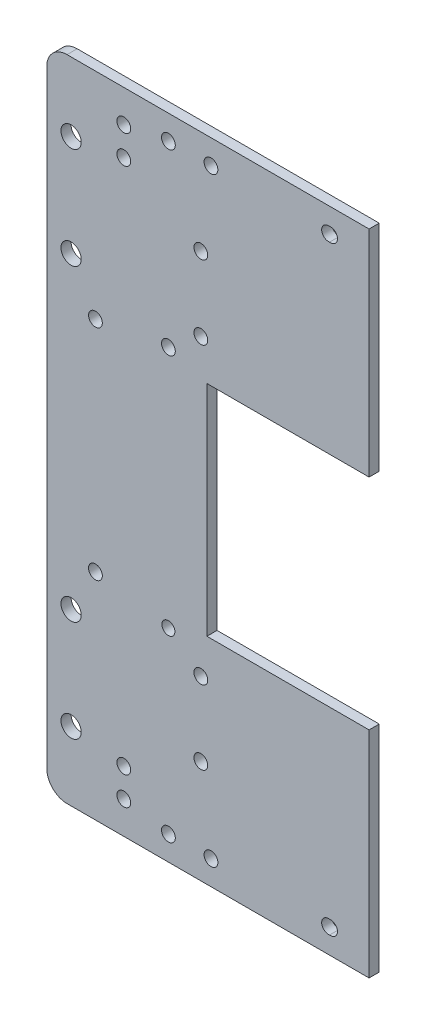
ISO-10303-21;
HEADER;
FILE_DESCRIPTION(('STEP AP214'),'2;1');
FILE_NAME('part.step','',(''),(''),'','','');
FILE_SCHEMA(('AUTOMOTIVE_DESIGN { 1 0 10303 214 1 1 1 1 }'));
ENDSEC;
DATA;
#1=APPLICATION_CONTEXT('core data for automotive mechanical design processes');
#2=APPLICATION_PROTOCOL_DEFINITION('international standard','automotive_design',2000,#1);
#3=PRODUCT_CONTEXT('',#1,'mechanical');
#4=PRODUCT('Part','Part','',(#3));
#5=PRODUCT_RELATED_PRODUCT_CATEGORY('part','',(#4));
#6=PRODUCT_DEFINITION_FORMATION('','',#4);
#7=PRODUCT_DEFINITION_CONTEXT('part definition',#1,'design');
#8=PRODUCT_DEFINITION('design','',#6,#7);
#9=PRODUCT_DEFINITION_SHAPE('','',#8);
#10=(LENGTH_UNIT() NAMED_UNIT(*) SI_UNIT(.MILLI.,.METRE.));
#11=(NAMED_UNIT(*) PLANE_ANGLE_UNIT() SI_UNIT($,.RADIAN.));
#12=(NAMED_UNIT(*) SI_UNIT($,.STERADIAN.) SOLID_ANGLE_UNIT());
#13=UNCERTAINTY_MEASURE_WITH_UNIT(LENGTH_MEASURE(1.E-05),#10,'distance_accuracy_value','');
#14=(GEOMETRIC_REPRESENTATION_CONTEXT(3) GLOBAL_UNCERTAINTY_ASSIGNED_CONTEXT((#13)) GLOBAL_UNIT_ASSIGNED_CONTEXT((#10,
#11,#12)) REPRESENTATION_CONTEXT('',''));
#15=CARTESIAN_POINT('',(0.,0.,0.));
#16=DIRECTION('',(0.,0.,1.));
#17=DIRECTION('',(1.,0.,0.));
#18=AXIS2_PLACEMENT_3D('',#15,#16,#17);
#19=CARTESIAN_POINT('',(0.,0.,0.));
#20=DIRECTION('',(0.,0.,-1.));
#21=DIRECTION('',(-1.,0.,0.));
#22=AXIS2_PLACEMENT_3D('',#19,#20,#21);
#23=PLANE('',#22);
#24=CARTESIAN_POINT('',(6.,42.,0.));
#25=DIRECTION('',(0.,0.,1.));
#26=DIRECTION('',(1.,0.,0.));
#27=AXIS2_PLACEMENT_3D('',#24,#25,#26);
#28=CIRCLE('',#27,2.49999999999999);
#29=CARTESIAN_POINT('',(8.49999999999999,42.,0.));
#30=VERTEX_POINT('',#29);
#31=EDGE_CURVE('E189',#30,#30,#28,.T.);
#32=ORIENTED_EDGE('',*,*,#31,.F.);
#33=EDGE_LOOP('',(#32));
#34=FACE_BOUND('',#33,.T.);
#35=CARTESIAN_POINT('',(30.,6.,0.));
#36=DIRECTION('',(0.,0.,1.));
#37=DIRECTION('',(1.,0.,0.));
#38=AXIS2_PLACEMENT_3D('',#35,#36,#37);
#39=CIRCLE('',#38,1.69999999999999);
#40=CARTESIAN_POINT('',(31.7,6.,0.));
#41=VERTEX_POINT('',#40);
#42=EDGE_CURVE('E321',#41,#41,#39,.T.);
#43=ORIENTED_EDGE('',*,*,#42,.F.);
#44=EDGE_LOOP('',(#43));
#45=FACE_BOUND('',#44,.T.);
#46=CARTESIAN_POINT('',(30.,50.,0.));
#47=DIRECTION('',(0.,0.,1.));
#48=DIRECTION('',(1.,0.,0.));
#49=AXIS2_PLACEMENT_3D('',#46,#47,#48);
#50=CIRCLE('',#49,1.59999999999998);
#51=CARTESIAN_POINT('',(31.6,50.,0.));
#52=VERTEX_POINT('',#51);
#53=EDGE_CURVE('E291',#52,#52,#50,.T.);
#54=ORIENTED_EDGE('',*,*,#53,.F.);
#55=EDGE_LOOP('',(#54));
#56=FACE_BOUND('',#55,.T.);
#57=CARTESIAN_POINT('',(19.,152.,0.));
#58=DIRECTION('',(0.,0.,1.));
#59=DIRECTION('',(1.,0.,0.));
#60=AXIS2_PLACEMENT_3D('',#57,#58,#59);
#61=CIRCLE('',#60,1.69999999999999);
#62=CARTESIAN_POINT('',(20.7,152.,0.));
#63=VERTEX_POINT('',#62);
#64=EDGE_CURVE('E294',#63,#63,#61,.T.);
#65=ORIENTED_EDGE('',*,*,#64,.F.);
#66=EDGE_LOOP('',(#65));
#67=FACE_BOUND('',#66,.T.);
#68=CARTESIAN_POINT('',(12.,107.,0.));
#69=DIRECTION('',(0.,0.,1.));
#70=DIRECTION('',(1.,0.,0.));
#71=AXIS2_PLACEMENT_3D('',#68,#69,#70);
#72=CIRCLE('',#71,1.69999999999999);
#73=CARTESIAN_POINT('',(13.7,107.,0.));
#74=VERTEX_POINT('',#73);
#75=EDGE_CURVE('E297',#74,#74,#72,.T.);
#76=ORIENTED_EDGE('',*,*,#75,.F.);
#77=EDGE_LOOP('',(#76));
#78=FACE_BOUND('',#77,.T.);
#79=CARTESIAN_POINT('',(12.,53.,0.));
#80=DIRECTION('',(0.,0.,1.));
#81=DIRECTION('',(1.,0.,0.));
#82=AXIS2_PLACEMENT_3D('',#79,#80,#81);
#83=CIRCLE('',#82,1.69999999999999);
#84=CARTESIAN_POINT('',(13.7,53.,0.));
#85=VERTEX_POINT('',#84);
#86=EDGE_CURVE('E300',#85,#85,#83,.T.);
#87=ORIENTED_EDGE('',*,*,#86,.F.);
#88=EDGE_LOOP('',(#87));
#89=FACE_BOUND('',#88,.T.);
#90=CARTESIAN_POINT('',(19.,145.,0.));
#91=DIRECTION('',(0.,0.,1.));
#92=DIRECTION('',(1.,0.,0.));
#93=AXIS2_PLACEMENT_3D('',#90,#91,#92);
#94=CIRCLE('',#93,1.69999999999999);
#95=CARTESIAN_POINT('',(20.7,145.,0.));
#96=VERTEX_POINT('',#95);
#97=EDGE_CURVE('E305',#96,#96,#94,.T.);
#98=ORIENTED_EDGE('',*,*,#97,.F.);
#99=EDGE_LOOP('',(#98));
#100=FACE_BOUND('',#99,.T.);
#101=CARTESIAN_POINT('',(19.,15.,0.));
#102=DIRECTION('',(0.,0.,1.));
#103=DIRECTION('',(1.,0.,0.));
#104=AXIS2_PLACEMENT_3D('',#101,#102,#103);
#105=CIRCLE('',#104,1.69999999999999);
#106=CARTESIAN_POINT('',(20.7,15.,0.));
#107=VERTEX_POINT('',#106);
#108=EDGE_CURVE('E310',#107,#107,#105,.T.);
#109=ORIENTED_EDGE('',*,*,#108,.F.);
#110=EDGE_LOOP('',(#109));
#111=FACE_BOUND('',#110,.T.);
#112=CARTESIAN_POINT('',(19.,8.,0.));
#113=DIRECTION('',(0.,0.,1.));
#114=DIRECTION('',(1.,0.,0.));
#115=AXIS2_PLACEMENT_3D('',#112,#113,#114);
#116=CIRCLE('',#115,1.69999999999999);
#117=CARTESIAN_POINT('',(20.7,8.,0.));
#118=VERTEX_POINT('',#117);
#119=EDGE_CURVE('E313',#118,#118,#116,.T.);
#120=ORIENTED_EDGE('',*,*,#119,.F.);
#121=EDGE_LOOP('',(#120));
#122=FACE_BOUND('',#121,.T.);
#123=CARTESIAN_POINT('',(30.,110.,0.));
#124=DIRECTION('',(0.,0.,1.));
#125=DIRECTION('',(1.,0.,0.));
#126=AXIS2_PLACEMENT_3D('',#123,#124,#125);
#127=CIRCLE('',#126,1.69999999999999);
#128=CARTESIAN_POINT('',(31.7,110.,0.));
#129=VERTEX_POINT('',#128);
#130=EDGE_CURVE('E316',#129,#129,#127,.T.);
#131=ORIENTED_EDGE('',*,*,#130,.F.);
#132=EDGE_LOOP('',(#131));
#133=FACE_BOUND('',#132,.T.);
#134=CARTESIAN_POINT('',(40.5,6.,0.));
#135=DIRECTION('',(0.,0.,1.));
#136=DIRECTION('',(1.,0.,0.));
#137=AXIS2_PLACEMENT_3D('',#134,#135,#136);
#138=CIRCLE('',#137,1.69999999999999);
#139=CARTESIAN_POINT('',(42.2,6.,0.));
#140=VERTEX_POINT('',#139);
#141=EDGE_CURVE('E169',#140,#140,#138,.T.);
#142=ORIENTED_EDGE('',*,*,#141,.F.);
#143=EDGE_LOOP('',(#142));
#144=FACE_BOUND('',#143,.T.);
#145=CARTESIAN_POINT('',(69.5,6.,0.));
#146=DIRECTION('',(0.,0.,1.));
#147=DIRECTION('',(1.,0.,0.));
#148=AXIS2_PLACEMENT_3D('',#145,#146,#147);
#149=CIRCLE('',#148,1.69999999999999);
#150=CARTESIAN_POINT('',(69.75,7.68151717208002,0.));
#151=VERTEX_POINT('',#150);
#152=CARTESIAN_POINT('',(69.75,4.31848282791998,0.));
#153=VERTEX_POINT('',#152);
#154=EDGE_CURVE('E163',#151,#153,#149,.T.);
#155=ORIENTED_EDGE('',*,*,#154,.F.);
#156=CARTESIAN_POINT('',(70.,6.,0.));
#157=DIRECTION('',(0.,0.,1.));
#158=DIRECTION('',(1.,0.,0.));
#159=AXIS2_PLACEMENT_3D('',#156,#157,#158);
#160=CIRCLE('',#159,1.7);
#161=EDGE_CURVE('E152',#153,#151,#160,.T.);
#162=ORIENTED_EDGE('',*,*,#161,.F.);
#163=EDGE_LOOP('',(#155,#162));
#164=FACE_BOUND('',#163,.T.);
#165=CARTESIAN_POINT('',(69.5,154.,0.));
#166=DIRECTION('',(0.,0.,1.));
#167=DIRECTION('',(1.,0.,0.));
#168=AXIS2_PLACEMENT_3D('',#165,#166,#167);
#169=CIRCLE('',#168,1.69999999999999);
#170=CARTESIAN_POINT('',(69.75,155.68151717208,0.));
#171=VERTEX_POINT('',#170);
#172=CARTESIAN_POINT('',(69.75,152.31848282792,0.));
#173=VERTEX_POINT('',#172);
#174=EDGE_CURVE('E157',#171,#173,#169,.T.);
#175=ORIENTED_EDGE('',*,*,#174,.F.);
#176=CARTESIAN_POINT('',(70.,154.,0.));
#177=DIRECTION('',(0.,0.,1.));
#178=DIRECTION('',(1.,0.,0.));
#179=AXIS2_PLACEMENT_3D('',#176,#177,#178);
#180=CIRCLE('',#179,1.7);
#181=EDGE_CURVE('E144',#173,#171,#180,.T.);
#182=ORIENTED_EDGE('',*,*,#181,.F.);
#183=EDGE_LOOP('',(#175,#182));
#184=FACE_BOUND('',#183,.T.);
#185=CARTESIAN_POINT('',(40.5,154.,0.));
#186=DIRECTION('',(0.,0.,1.));
#187=DIRECTION('',(1.,0.,0.));
#188=AXIS2_PLACEMENT_3D('',#185,#186,#187);
#189=CIRCLE('',#188,1.69999999999999);
#190=CARTESIAN_POINT('',(42.2,154.,0.));
#191=VERTEX_POINT('',#190);
#192=EDGE_CURVE('E162',#191,#191,#189,.T.);
#193=ORIENTED_EDGE('',*,*,#192,.F.);
#194=EDGE_LOOP('',(#193));
#195=FACE_BOUND('',#194,.T.);
#196=CARTESIAN_POINT('',(30.,154.,0.));
#197=DIRECTION('',(0.,0.,1.));
#198=DIRECTION('',(1.,0.,0.));
#199=AXIS2_PLACEMENT_3D('',#196,#197,#198);
#200=CIRCLE('',#199,1.69999999999999);
#201=CARTESIAN_POINT('',(31.7,154.,0.));
#202=VERTEX_POINT('',#201);
#203=EDGE_CURVE('E166',#202,#202,#200,.T.);
#204=ORIENTED_EDGE('',*,*,#203,.F.);
#205=EDGE_LOOP('',(#204));
#206=FACE_BOUND('',#205,.T.);
#207=CARTESIAN_POINT('',(6.,143.,0.));
#208=DIRECTION('',(0.,0.,1.));
#209=DIRECTION('',(1.,0.,0.));
#210=AXIS2_PLACEMENT_3D('',#207,#208,#209);
#211=CIRCLE('',#210,2.49999999999999);
#212=CARTESIAN_POINT('',(8.49999999999999,143.,0.));
#213=VERTEX_POINT('',#212);
#214=EDGE_CURVE('E180',#213,#213,#211,.T.);
#215=ORIENTED_EDGE('',*,*,#214,.F.);
#216=EDGE_LOOP('',(#215));
#217=FACE_BOUND('',#216,.T.);
#218=CARTESIAN_POINT('',(6.,118.,0.));
#219=DIRECTION('',(0.,0.,1.));
#220=DIRECTION('',(1.,0.,0.));
#221=AXIS2_PLACEMENT_3D('',#218,#219,#220);
#222=CIRCLE('',#221,2.49999999999999);
#223=CARTESIAN_POINT('',(8.49999999999999,118.,0.));
#224=VERTEX_POINT('',#223);
#225=EDGE_CURVE('E186',#224,#224,#222,.T.);
#226=ORIENTED_EDGE('',*,*,#225,.F.);
#227=EDGE_LOOP('',(#226));
#228=FACE_BOUND('',#227,.T.);
#229=CARTESIAN_POINT('',(6.,17.,0.));
#230=DIRECTION('',(0.,0.,1.));
#231=DIRECTION('',(1.,0.,0.));
#232=AXIS2_PLACEMENT_3D('',#229,#230,#231);
#233=CIRCLE('',#232,2.49999999999999);
#234=CARTESIAN_POINT('',(8.49999999999999,17.,0.));
#235=VERTEX_POINT('',#234);
#236=EDGE_CURVE('E196',#235,#235,#233,.T.);
#237=ORIENTED_EDGE('',*,*,#236,.F.);
#238=EDGE_LOOP('',(#237));
#239=FACE_BOUND('',#238,.T.);
#240=CARTESIAN_POINT('',(38.,43.7,0.));
#241=DIRECTION('',(0.,0.,1.));
#242=DIRECTION('',(1.,0.,0.));
#243=AXIS2_PLACEMENT_3D('',#240,#241,#242);
#244=CIRCLE('',#243,1.7);
#245=CARTESIAN_POINT('',(39.7,43.7,0.));
#246=VERTEX_POINT('',#245);
#247=EDGE_CURVE('E232',#246,#246,#244,.T.);
#248=ORIENTED_EDGE('',*,*,#247,.F.);
#249=EDGE_LOOP('',(#248));
#250=FACE_BOUND('',#249,.T.);
#251=CARTESIAN_POINT('',(38.,25.5,0.));
#252=DIRECTION('',(0.,0.,1.));
#253=DIRECTION('',(1.,0.,0.));
#254=AXIS2_PLACEMENT_3D('',#251,#252,#253);
#255=CIRCLE('',#254,1.7);
#256=CARTESIAN_POINT('',(39.7,25.5,0.));
#257=VERTEX_POINT('',#256);
#258=EDGE_CURVE('E222',#257,#257,#255,.T.);
#259=ORIENTED_EDGE('',*,*,#258,.F.);
#260=EDGE_LOOP('',(#259));
#261=FACE_BOUND('',#260,.T.);
#262=CARTESIAN_POINT('',(38.,116.3,0.));
#263=DIRECTION('',(0.,0.,1.));
#264=DIRECTION('',(1.,0.,0.));
#265=AXIS2_PLACEMENT_3D('',#262,#263,#264);
#266=CIRCLE('',#265,1.7);
#267=CARTESIAN_POINT('',(39.7,116.3,0.));
#268=VERTEX_POINT('',#267);
#269=EDGE_CURVE('E359',#268,#268,#266,.T.);
#270=ORIENTED_EDGE('',*,*,#269,.F.);
#271=EDGE_LOOP('',(#270));
#272=FACE_BOUND('',#271,.T.);
#273=CARTESIAN_POINT('',(38.,134.5,0.));
#274=DIRECTION('',(0.,0.,1.));
#275=DIRECTION('',(1.,0.,0.));
#276=AXIS2_PLACEMENT_3D('',#273,#274,#275);
#277=CIRCLE('',#276,1.7);
#278=CARTESIAN_POINT('',(39.7,134.5,0.));
#279=VERTEX_POINT('',#278);
#280=EDGE_CURVE('E229',#279,#279,#277,.T.);
#281=ORIENTED_EDGE('',*,*,#280,.F.);
#282=EDGE_LOOP('',(#281));
#283=FACE_BOUND('',#282,.T.);
#284=DIRECTION('',(-1.,0.,0.));
#285=VECTOR('',#284,1.);
#286=CARTESIAN_POINT('',(0.,53.,0.));
#287=LINE('',#286,#285);
#288=CARTESIAN_POINT('',(79.5,53.,0.));
#289=VERTEX_POINT('',#288);
#290=CARTESIAN_POINT('',(39.5,53.,0.));
#291=VERTEX_POINT('',#290);
#292=EDGE_CURVE('E343',#289,#291,#287,.T.);
#293=ORIENTED_EDGE('',*,*,#292,.T.);
#294=DIRECTION('',(0.,-1.,0.));
#295=VECTOR('',#294,1.);
#296=CARTESIAN_POINT('',(39.5,0.,0.));
#297=LINE('',#296,#295);
#298=CARTESIAN_POINT('',(39.5,107.,0.));
#299=VERTEX_POINT('',#298);
#300=EDGE_CURVE('E351',#299,#291,#297,.T.);
#301=ORIENTED_EDGE('',*,*,#300,.F.);
#302=DIRECTION('',(-1.,0.,0.));
#303=VECTOR('',#302,1.);
#304=CARTESIAN_POINT('',(0.,107.,0.));
#305=LINE('',#304,#303);
#306=CARTESIAN_POINT('',(79.5,107.,0.));
#307=VERTEX_POINT('',#306);
#308=EDGE_CURVE('E338',#307,#299,#305,.T.);
#309=ORIENTED_EDGE('',*,*,#308,.F.);
#310=DIRECTION('',(0.,1.,0.));
#311=VECTOR('',#310,1.);
#312=CARTESIAN_POINT('',(79.5,160.,0.));
#313=LINE('',#312,#311);
#314=CARTESIAN_POINT('',(79.5,160.,0.));
#315=VERTEX_POINT('',#314);
#316=EDGE_CURVE('E209',#307,#315,#313,.T.);
#317=ORIENTED_EDGE('',*,*,#316,.T.);
#318=DIRECTION('',(1.,0.,0.));
#319=VECTOR('',#318,1.);
#320=CARTESIAN_POINT('',(0.,160.,0.));
#321=LINE('',#320,#319);
#322=CARTESIAN_POINT('',(5.,160.,0.));
#323=VERTEX_POINT('',#322);
#324=EDGE_CURVE('E272',#323,#315,#321,.T.);
#325=ORIENTED_EDGE('',*,*,#324,.F.);
#326=CARTESIAN_POINT('',(5.,155.,0.));
#327=DIRECTION('',(0.,0.,-1.));
#328=DIRECTION('',(-1.,0.,0.));
#329=AXIS2_PLACEMENT_3D('',#326,#327,#328);
#330=CIRCLE('',#329,5.);
#331=CARTESIAN_POINT('',(0.,155.,0.));
#332=VERTEX_POINT('',#331);
#333=EDGE_CURVE('E208',#323,#332,#330,.F.);
#334=ORIENTED_EDGE('',*,*,#333,.T.);
#335=DIRECTION('',(0.,1.,0.));
#336=VECTOR('',#335,1.);
#337=CARTESIAN_POINT('',(0.,0.,0.));
#338=LINE('',#337,#336);
#339=CARTESIAN_POINT('',(0.,5.,0.));
#340=VERTEX_POINT('',#339);
#341=EDGE_CURVE('E275',#340,#332,#338,.T.);
#342=ORIENTED_EDGE('',*,*,#341,.F.);
#343=CARTESIAN_POINT('',(5.,5.,0.));
#344=DIRECTION('',(0.,0.,-1.));
#345=DIRECTION('',(-1.,0.,0.));
#346=AXIS2_PLACEMENT_3D('',#343,#344,#345);
#347=CIRCLE('',#346,5.);
#348=CARTESIAN_POINT('',(5.,0.,0.));
#349=VERTEX_POINT('',#348);
#350=EDGE_CURVE('E204',#340,#349,#347,.F.);
#351=ORIENTED_EDGE('',*,*,#350,.T.);
#352=DIRECTION('',(-1.,0.,0.));
#353=VECTOR('',#352,1.);
#354=CARTESIAN_POINT('',(82.,0.,0.));
#355=LINE('',#354,#353);
#356=CARTESIAN_POINT('',(79.5,0.,0.));
#357=VERTEX_POINT('',#356);
#358=EDGE_CURVE('E213',#357,#349,#355,.T.);
#359=ORIENTED_EDGE('',*,*,#358,.F.);
#360=EDGE_CURVE('E205',#357,#289,#313,.T.);
#361=ORIENTED_EDGE('',*,*,#360,.T.);
#362=EDGE_LOOP('',(#293,#301,#309,#317,#325,#334,#342,#351,#359,#361));
#363=FACE_BOUND('',#362,.T.);
#364=ADVANCED_FACE('F45',(#34,#45,#56,#67,#78,#89,#100,#111,#122,#133,#144,#164,#184,#195,#206,
#217,#228,#239,#250,#261,#272,#283,#363),#23,.F.);
#365=CARTESIAN_POINT('',(0.,0.,-2.5));
#366=DIRECTION('',(0.,0.,1.));
#367=DIRECTION('',(1.,0.,0.));
#368=AXIS2_PLACEMENT_3D('',#365,#366,#367);
#369=PLANE('',#368);
#370=CARTESIAN_POINT('',(30.,50.,-2.5));
#371=DIRECTION('',(0.,0.,1.));
#372=DIRECTION('',(1.,0.,0.));
#373=AXIS2_PLACEMENT_3D('',#370,#371,#372);
#374=CIRCLE('',#373,1.59999999999998);
#375=CARTESIAN_POINT('',(31.6,50.,-2.5));
#376=VERTEX_POINT('',#375);
#377=EDGE_CURVE('E268',#376,#376,#374,.T.);
#378=ORIENTED_EDGE('',*,*,#377,.T.);
#379=EDGE_LOOP('',(#378));
#380=FACE_BOUND('',#379,.T.);
#381=CARTESIAN_POINT('',(19.,152.,-2.5));
#382=DIRECTION('',(0.,0.,1.));
#383=DIRECTION('',(1.,0.,0.));
#384=AXIS2_PLACEMENT_3D('',#381,#382,#383);
#385=CIRCLE('',#384,1.69999999999999);
#386=CARTESIAN_POINT('',(20.7,152.,-2.5));
#387=VERTEX_POINT('',#386);
#388=EDGE_CURVE('E264',#387,#387,#385,.T.);
#389=ORIENTED_EDGE('',*,*,#388,.T.);
#390=EDGE_LOOP('',(#389));
#391=FACE_BOUND('',#390,.T.);
#392=CARTESIAN_POINT('',(12.,107.,-2.5));
#393=DIRECTION('',(0.,0.,1.));
#394=DIRECTION('',(1.,0.,0.));
#395=AXIS2_PLACEMENT_3D('',#392,#393,#394);
#396=CIRCLE('',#395,1.69999999999998);
#397=CARTESIAN_POINT('',(13.7,107.,-2.5));
#398=VERTEX_POINT('',#397);
#399=EDGE_CURVE('E261',#398,#398,#396,.T.);
#400=ORIENTED_EDGE('',*,*,#399,.T.);
#401=EDGE_LOOP('',(#400));
#402=FACE_BOUND('',#401,.T.);
#403=CARTESIAN_POINT('',(12.,53.,-2.5));
#404=DIRECTION('',(0.,0.,1.));
#405=DIRECTION('',(1.,0.,0.));
#406=AXIS2_PLACEMENT_3D('',#403,#404,#405);
#407=CIRCLE('',#406,1.69999999999998);
#408=CARTESIAN_POINT('',(13.7,53.,-2.5));
#409=VERTEX_POINT('',#408);
#410=EDGE_CURVE('E265',#409,#409,#407,.T.);
#411=ORIENTED_EDGE('',*,*,#410,.T.);
#412=EDGE_LOOP('',(#411));
#413=FACE_BOUND('',#412,.T.);
#414=CARTESIAN_POINT('',(19.,145.,-2.5));
#415=DIRECTION('',(0.,0.,1.));
#416=DIRECTION('',(1.,0.,0.));
#417=AXIS2_PLACEMENT_3D('',#414,#415,#416);
#418=CIRCLE('',#417,1.69999999999999);
#419=CARTESIAN_POINT('',(20.7,145.,-2.5));
#420=VERTEX_POINT('',#419);
#421=EDGE_CURVE('E260',#420,#420,#418,.T.);
#422=ORIENTED_EDGE('',*,*,#421,.T.);
#423=EDGE_LOOP('',(#422));
#424=FACE_BOUND('',#423,.T.);
#425=CARTESIAN_POINT('',(19.,15.,-2.5));
#426=DIRECTION('',(0.,0.,1.));
#427=DIRECTION('',(1.,0.,0.));
#428=AXIS2_PLACEMENT_3D('',#425,#426,#427);
#429=CIRCLE('',#428,1.69999999999999);
#430=CARTESIAN_POINT('',(20.7,15.,-2.5));
#431=VERTEX_POINT('',#430);
#432=EDGE_CURVE('E257',#431,#431,#429,.T.);
#433=ORIENTED_EDGE('',*,*,#432,.T.);
#434=EDGE_LOOP('',(#433));
#435=FACE_BOUND('',#434,.T.);
#436=CARTESIAN_POINT('',(19.,8.,-2.5));
#437=DIRECTION('',(0.,0.,1.));
#438=DIRECTION('',(1.,0.,0.));
#439=AXIS2_PLACEMENT_3D('',#436,#437,#438);
#440=CIRCLE('',#439,1.69999999999999);
#441=CARTESIAN_POINT('',(20.7,8.,-2.5));
#442=VERTEX_POINT('',#441);
#443=EDGE_CURVE('E254',#442,#442,#440,.T.);
#444=ORIENTED_EDGE('',*,*,#443,.T.);
#445=EDGE_LOOP('',(#444));
#446=FACE_BOUND('',#445,.T.);
#447=CARTESIAN_POINT('',(30.,110.,-2.5));
#448=DIRECTION('',(0.,0.,1.));
#449=DIRECTION('',(1.,0.,0.));
#450=AXIS2_PLACEMENT_3D('',#447,#448,#449);
#451=CIRCLE('',#450,1.69999999999998);
#452=CARTESIAN_POINT('',(31.7,110.,-2.5));
#453=VERTEX_POINT('',#452);
#454=EDGE_CURVE('E253',#453,#453,#451,.T.);
#455=ORIENTED_EDGE('',*,*,#454,.T.);
#456=EDGE_LOOP('',(#455));
#457=FACE_BOUND('',#456,.T.);
#458=CARTESIAN_POINT('',(30.,6.,-2.5));
#459=DIRECTION('',(0.,0.,1.));
#460=DIRECTION('',(1.,0.,0.));
#461=AXIS2_PLACEMENT_3D('',#458,#459,#460);
#462=CIRCLE('',#461,1.69999999999998);
#463=CARTESIAN_POINT('',(31.7,6.,-2.5));
#464=VERTEX_POINT('',#463);
#465=EDGE_CURVE('E246',#464,#464,#462,.T.);
#466=ORIENTED_EDGE('',*,*,#465,.T.);
#467=EDGE_LOOP('',(#466));
#468=FACE_BOUND('',#467,.T.);
#469=CARTESIAN_POINT('',(40.5,6.,-2.5));
#470=DIRECTION('',(0.,0.,1.));
#471=DIRECTION('',(1.,0.,0.));
#472=AXIS2_PLACEMENT_3D('',#469,#470,#471);
#473=CIRCLE('',#472,1.69999999999998);
#474=CARTESIAN_POINT('',(42.2,6.,-2.5));
#475=VERTEX_POINT('',#474);
#476=EDGE_CURVE('E243',#475,#475,#473,.T.);
#477=ORIENTED_EDGE('',*,*,#476,.T.);
#478=EDGE_LOOP('',(#477));
#479=FACE_BOUND('',#478,.T.);
#480=CARTESIAN_POINT('',(69.5,6.,-2.5));
#481=DIRECTION('',(0.,0.,1.));
#482=DIRECTION('',(1.,0.,0.));
#483=AXIS2_PLACEMENT_3D('',#480,#481,#482);
#484=CIRCLE('',#483,1.69999999999999);
#485=CARTESIAN_POINT('',(69.75,7.68151717208002,-2.5));
#486=VERTEX_POINT('',#485);
#487=CARTESIAN_POINT('',(69.75,4.31848282791998,-2.5));
#488=VERTEX_POINT('',#487);
#489=EDGE_CURVE('E237',#486,#488,#484,.T.);
#490=ORIENTED_EDGE('',*,*,#489,.T.);
#491=CARTESIAN_POINT('',(70.,6.,-2.5));
#492=DIRECTION('',(0.,0.,1.));
#493=DIRECTION('',(1.,0.,0.));
#494=AXIS2_PLACEMENT_3D('',#491,#492,#493);
#495=CIRCLE('',#494,1.7);
#496=EDGE_CURVE('E60',#488,#486,#495,.T.);
#497=ORIENTED_EDGE('',*,*,#496,.T.);
#498=EDGE_LOOP('',(#490,#497));
#499=FACE_BOUND('',#498,.T.);
#500=CARTESIAN_POINT('',(69.5,154.,-2.5));
#501=DIRECTION('',(0.,0.,1.));
#502=DIRECTION('',(1.,0.,0.));
#503=AXIS2_PLACEMENT_3D('',#500,#501,#502);
#504=CIRCLE('',#503,1.69999999999999);
#505=CARTESIAN_POINT('',(69.75,155.68151717208,-2.5));
#506=VERTEX_POINT('',#505);
#507=CARTESIAN_POINT('',(69.75,152.31848282792,-2.5));
#508=VERTEX_POINT('',#507);
#509=EDGE_CURVE('E159',#506,#508,#504,.T.);
#510=ORIENTED_EDGE('',*,*,#509,.T.);
#511=CARTESIAN_POINT('',(70.,154.,-2.5));
#512=DIRECTION('',(0.,0.,1.));
#513=DIRECTION('',(1.,0.,0.));
#514=AXIS2_PLACEMENT_3D('',#511,#512,#513);
#515=CIRCLE('',#514,1.7);
#516=EDGE_CURVE('E68',#508,#506,#515,.T.);
#517=ORIENTED_EDGE('',*,*,#516,.T.);
#518=EDGE_LOOP('',(#510,#517));
#519=FACE_BOUND('',#518,.T.);
#520=CARTESIAN_POINT('',(40.5,154.,-2.5));
#521=DIRECTION('',(0.,0.,1.));
#522=DIRECTION('',(1.,0.,0.));
#523=AXIS2_PLACEMENT_3D('',#520,#521,#522);
#524=CIRCLE('',#523,1.69999999999998);
#525=CARTESIAN_POINT('',(42.2,154.,-2.5));
#526=VERTEX_POINT('',#525);
#527=EDGE_CURVE('E176',#526,#526,#524,.T.);
#528=ORIENTED_EDGE('',*,*,#527,.T.);
#529=EDGE_LOOP('',(#528));
#530=FACE_BOUND('',#529,.T.);
#531=CARTESIAN_POINT('',(30.,154.,-2.5));
#532=DIRECTION('',(0.,0.,1.));
#533=DIRECTION('',(1.,0.,0.));
#534=AXIS2_PLACEMENT_3D('',#531,#532,#533);
#535=CIRCLE('',#534,1.69999999999998);
#536=CARTESIAN_POINT('',(31.7,154.,-2.5));
#537=VERTEX_POINT('',#536);
#538=EDGE_CURVE('E173',#537,#537,#535,.T.);
#539=ORIENTED_EDGE('',*,*,#538,.T.);
#540=EDGE_LOOP('',(#539));
#541=FACE_BOUND('',#540,.T.);
#542=CARTESIAN_POINT('',(6.,143.,-2.5));
#543=DIRECTION('',(0.,0.,1.));
#544=DIRECTION('',(1.,0.,0.));
#545=AXIS2_PLACEMENT_3D('',#542,#543,#544);
#546=CIRCLE('',#545,2.49999999999999);
#547=CARTESIAN_POINT('',(8.49999999999999,143.,-2.5));
#548=VERTEX_POINT('',#547);
#549=EDGE_CURVE('E177',#548,#548,#546,.T.);
#550=ORIENTED_EDGE('',*,*,#549,.T.);
#551=EDGE_LOOP('',(#550));
#552=FACE_BOUND('',#551,.T.);
#553=CARTESIAN_POINT('',(6.,118.,-2.5));
#554=DIRECTION('',(0.,0.,1.));
#555=DIRECTION('',(1.,0.,0.));
#556=AXIS2_PLACEMENT_3D('',#553,#554,#555);
#557=CIRCLE('',#556,2.49999999999999);
#558=CARTESIAN_POINT('',(8.49999999999999,118.,-2.5));
#559=VERTEX_POINT('',#558);
#560=EDGE_CURVE('E183',#559,#559,#557,.T.);
#561=ORIENTED_EDGE('',*,*,#560,.T.);
#562=EDGE_LOOP('',(#561));
#563=FACE_BOUND('',#562,.T.);
#564=CARTESIAN_POINT('',(6.,42.,-2.5));
#565=DIRECTION('',(0.,0.,1.));
#566=DIRECTION('',(1.,0.,0.));
#567=AXIS2_PLACEMENT_3D('',#564,#565,#566);
#568=CIRCLE('',#567,2.49999999999999);
#569=CARTESIAN_POINT('',(8.49999999999999,42.,-2.5));
#570=VERTEX_POINT('',#569);
#571=EDGE_CURVE('E190',#570,#570,#568,.T.);
#572=ORIENTED_EDGE('',*,*,#571,.T.);
#573=EDGE_LOOP('',(#572));
#574=FACE_BOUND('',#573,.T.);
#575=CARTESIAN_POINT('',(6.,17.,-2.5));
#576=DIRECTION('',(0.,0.,1.));
#577=DIRECTION('',(1.,0.,0.));
#578=AXIS2_PLACEMENT_3D('',#575,#576,#577);
#579=CIRCLE('',#578,2.49999999999999);
#580=CARTESIAN_POINT('',(8.49999999999999,17.,-2.5));
#581=VERTEX_POINT('',#580);
#582=EDGE_CURVE('E193',#581,#581,#579,.T.);
#583=ORIENTED_EDGE('',*,*,#582,.T.);
#584=EDGE_LOOP('',(#583));
#585=FACE_BOUND('',#584,.T.);
#586=CARTESIAN_POINT('',(38.,43.7,-2.5));
#587=DIRECTION('',(0.,0.,1.));
#588=DIRECTION('',(1.,0.,0.));
#589=AXIS2_PLACEMENT_3D('',#586,#587,#588);
#590=CIRCLE('',#589,1.7);
#591=CARTESIAN_POINT('',(39.7,43.7,-2.5));
#592=VERTEX_POINT('',#591);
#593=EDGE_CURVE('E218',#592,#592,#590,.T.);
#594=ORIENTED_EDGE('',*,*,#593,.T.);
#595=EDGE_LOOP('',(#594));
#596=FACE_BOUND('',#595,.T.);
#597=CARTESIAN_POINT('',(38.,25.5,-2.5));
#598=DIRECTION('',(0.,0.,1.));
#599=DIRECTION('',(1.,0.,0.));
#600=AXIS2_PLACEMENT_3D('',#597,#598,#599);
#601=CIRCLE('',#600,1.7);
#602=CARTESIAN_POINT('',(39.7,25.5,-2.5));
#603=VERTEX_POINT('',#602);
#604=EDGE_CURVE('E221',#603,#603,#601,.T.);
#605=ORIENTED_EDGE('',*,*,#604,.T.);
#606=EDGE_LOOP('',(#605));
#607=FACE_BOUND('',#606,.T.);
#608=CARTESIAN_POINT('',(38.,116.3,-2.5));
#609=DIRECTION('',(0.,0.,1.));
#610=DIRECTION('',(1.,0.,0.));
#611=AXIS2_PLACEMENT_3D('',#608,#609,#610);
#612=CIRCLE('',#611,1.7);
#613=CARTESIAN_POINT('',(39.7,116.3,-2.5));
#614=VERTEX_POINT('',#613);
#615=EDGE_CURVE('E225',#614,#614,#612,.T.);
#616=ORIENTED_EDGE('',*,*,#615,.T.);
#617=EDGE_LOOP('',(#616));
#618=FACE_BOUND('',#617,.T.);
#619=CARTESIAN_POINT('',(38.,134.5,-2.5));
#620=DIRECTION('',(0.,0.,1.));
#621=DIRECTION('',(1.,0.,0.));
#622=AXIS2_PLACEMENT_3D('',#619,#620,#621);
#623=CIRCLE('',#622,1.7);
#624=CARTESIAN_POINT('',(39.7,134.5,-2.5));
#625=VERTEX_POINT('',#624);
#626=EDGE_CURVE('E228',#625,#625,#623,.T.);
#627=ORIENTED_EDGE('',*,*,#626,.T.);
#628=EDGE_LOOP('',(#627));
#629=FACE_BOUND('',#628,.T.);
#630=DIRECTION('',(-1.,0.,0.));
#631=VECTOR('',#630,1.);
#632=CARTESIAN_POINT('',(0.,53.,-2.5));
#633=LINE('',#632,#631);
#634=CARTESIAN_POINT('',(79.5,53.,-2.5));
#635=VERTEX_POINT('',#634);
#636=CARTESIAN_POINT('',(39.5,53.,-2.5));
#637=VERTEX_POINT('',#636);
#638=EDGE_CURVE('E346',#635,#637,#633,.T.);
#639=ORIENTED_EDGE('',*,*,#638,.F.);
#640=DIRECTION('',(0.,1.,0.));
#641=VECTOR('',#640,1.);
#642=CARTESIAN_POINT('',(79.5,0.,-2.5));
#643=LINE('',#642,#641);
#644=CARTESIAN_POINT('',(79.5,0.,-2.5));
#645=VERTEX_POINT('',#644);
#646=EDGE_CURVE('E215',#645,#635,#643,.T.);
#647=ORIENTED_EDGE('',*,*,#646,.F.);
#648=DIRECTION('',(1.,0.,0.));
#649=VECTOR('',#648,1.);
#650=CARTESIAN_POINT('',(0.,0.,-2.5));
#651=LINE('',#650,#649);
#652=CARTESIAN_POINT('',(5.,0.,-2.5));
#653=VERTEX_POINT('',#652);
#654=EDGE_CURVE('E288',#653,#645,#651,.T.);
#655=ORIENTED_EDGE('',*,*,#654,.F.);
#656=CARTESIAN_POINT('',(5.,5.,-2.5));
#657=DIRECTION('',(0.,0.,1.));
#658=DIRECTION('',(1.,0.,0.));
#659=AXIS2_PLACEMENT_3D('',#656,#657,#658);
#660=CIRCLE('',#659,5.);
#661=CARTESIAN_POINT('',(0.,5.,-2.5));
#662=VERTEX_POINT('',#661);
#663=EDGE_CURVE('E287',#653,#662,#660,.F.);
#664=ORIENTED_EDGE('',*,*,#663,.T.);
#665=DIRECTION('',(0.,1.,0.));
#666=VECTOR('',#665,1.);
#667=CARTESIAN_POINT('',(0.,0.,-2.5));
#668=LINE('',#667,#666);
#669=CARTESIAN_POINT('',(0.,155.,-2.5));
#670=VERTEX_POINT('',#669);
#671=EDGE_CURVE('E271',#662,#670,#668,.T.);
#672=ORIENTED_EDGE('',*,*,#671,.T.);
#673=CARTESIAN_POINT('',(5.,155.,-2.5));
#674=DIRECTION('',(0.,0.,1.));
#675=DIRECTION('',(1.,0.,0.));
#676=AXIS2_PLACEMENT_3D('',#673,#674,#675);
#677=CIRCLE('',#676,5.);
#678=CARTESIAN_POINT('',(5.,160.,-2.5));
#679=VERTEX_POINT('',#678);
#680=EDGE_CURVE('E283',#670,#679,#677,.F.);
#681=ORIENTED_EDGE('',*,*,#680,.T.);
#682=DIRECTION('',(1.,0.,0.));
#683=VECTOR('',#682,1.);
#684=CARTESIAN_POINT('',(0.,160.,-2.5));
#685=LINE('',#684,#683);
#686=CARTESIAN_POINT('',(79.5,160.,-2.5));
#687=VERTEX_POINT('',#686);
#688=EDGE_CURVE('E284',#679,#687,#685,.T.);
#689=ORIENTED_EDGE('',*,*,#688,.T.);
#690=CARTESIAN_POINT('',(79.5,107.,-2.5));
#691=VERTEX_POINT('',#690);
#692=EDGE_CURVE('E199',#691,#687,#643,.T.);
#693=ORIENTED_EDGE('',*,*,#692,.F.);
#694=DIRECTION('',(-1.,0.,0.));
#695=VECTOR('',#694,1.);
#696=CARTESIAN_POINT('',(0.,107.,-2.5));
#697=LINE('',#696,#695);
#698=CARTESIAN_POINT('',(39.5,107.,-2.5));
#699=VERTEX_POINT('',#698);
#700=EDGE_CURVE('E339',#691,#699,#697,.T.);
#701=ORIENTED_EDGE('',*,*,#700,.T.);
#702=DIRECTION('',(0.,-1.,0.));
#703=VECTOR('',#702,1.);
#704=CARTESIAN_POINT('',(39.5,0.,-2.5));
#705=LINE('',#704,#703);
#706=EDGE_CURVE('E342',#699,#637,#705,.T.);
#707=ORIENTED_EDGE('',*,*,#706,.T.);
#708=EDGE_LOOP('',(#639,#647,#655,#664,#672,#681,#689,#693,#701,#707));
#709=FACE_BOUND('',#708,.T.);
#710=ADVANCED_FACE('F241',(#380,#391,#402,#413,#424,#435,#446,#457,#468,#479,#499,#519,#530,
#541,#552,#563,#574,#585,#596,#607,#618,#629,#709),#369,.F.);
#711=CARTESIAN_POINT('',(79.5,0.,0.));
#712=DIRECTION('',(-1.,0.,0.));
#713=DIRECTION('',(0.,0.,1.));
#714=AXIS2_PLACEMENT_3D('',#711,#712,#713);
#715=PLANE('',#714);
#716=DIRECTION('',(0.,0.,1.));
#717=VECTOR('',#716,1.);
#718=CARTESIAN_POINT('',(79.5,53.,-2.5));
#719=LINE('',#718,#717);
#720=EDGE_CURVE('E356',#635,#289,#719,.T.);
#721=ORIENTED_EDGE('',*,*,#720,.T.);
#722=ORIENTED_EDGE('',*,*,#360,.F.);
#723=DIRECTION('',(0.,0.,1.));
#724=VECTOR('',#723,1.);
#725=CARTESIAN_POINT('',(79.5,0.,-2.5));
#726=LINE('',#725,#724);
#727=EDGE_CURVE('E210',#645,#357,#726,.T.);
#728=ORIENTED_EDGE('',*,*,#727,.F.);
#729=ORIENTED_EDGE('',*,*,#646,.T.);
#730=EDGE_LOOP('',(#721,#722,#728,#729));
#731=FACE_BOUND('',#730,.T.);
#732=ADVANCED_FACE('F417',(#731),#715,.F.);
#733=CARTESIAN_POINT('',(0.,160.,0.));
#734=DIRECTION('',(0.,1.,0.));
#735=DIRECTION('',(0.,0.,1.));
#736=AXIS2_PLACEMENT_3D('',#733,#734,#735);
#737=PLANE('',#736);
#738=DIRECTION('',(0.,0.,-1.));
#739=VECTOR('',#738,1.);
#740=CARTESIAN_POINT('',(79.5,160.,-2.5));
#741=LINE('',#740,#739);
#742=EDGE_CURVE('E200',#315,#687,#741,.T.);
#743=ORIENTED_EDGE('',*,*,#742,.T.);
#744=ORIENTED_EDGE('',*,*,#688,.F.);
#745=DIRECTION('',(0.,0.,-1.));
#746=VECTOR('',#745,1.);
#747=CARTESIAN_POINT('',(5.,160.,0.));
#748=LINE('',#747,#746);
#749=EDGE_CURVE('E203',#679,#323,#748,.F.);
#750=ORIENTED_EDGE('',*,*,#749,.T.);
#751=ORIENTED_EDGE('',*,*,#324,.T.);
#752=EDGE_LOOP('',(#743,#744,#750,#751));
#753=FACE_BOUND('',#752,.T.);
#754=ADVANCED_FACE('F47',(#753),#737,.T.);
#755=CARTESIAN_POINT('',(0.,0.,0.));
#756=DIRECTION('',(-1.,0.,0.));
#757=DIRECTION('',(0.,0.,1.));
#758=AXIS2_PLACEMENT_3D('',#755,#756,#757);
#759=PLANE('',#758);
#760=ORIENTED_EDGE('',*,*,#341,.T.);
#761=DIRECTION('',(0.,0.,-1.));
#762=VECTOR('',#761,1.);
#763=CARTESIAN_POINT('',(0.,155.,0.));
#764=LINE('',#763,#762);
#765=EDGE_CURVE('E278',#332,#670,#764,.T.);
#766=ORIENTED_EDGE('',*,*,#765,.T.);
#767=ORIENTED_EDGE('',*,*,#671,.F.);
#768=DIRECTION('',(0.,0.,-1.));
#769=VECTOR('',#768,1.);
#770=CARTESIAN_POINT('',(0.,5.,0.));
#771=LINE('',#770,#769);
#772=EDGE_CURVE('E214',#662,#340,#771,.F.);
#773=ORIENTED_EDGE('',*,*,#772,.T.);
#774=EDGE_LOOP('',(#760,#766,#767,#773));
#775=FACE_BOUND('',#774,.T.);
#776=ADVANCED_FACE('F421',(#775),#759,.T.);
#777=CARTESIAN_POINT('',(82.,0.,0.));
#778=DIRECTION('',(0.,-1.,0.));
#779=DIRECTION('',(0.,0.,-1.));
#780=AXIS2_PLACEMENT_3D('',#777,#778,#779);
#781=PLANE('',#780);
#782=ORIENTED_EDGE('',*,*,#727,.T.);
#783=ORIENTED_EDGE('',*,*,#358,.T.);
#784=DIRECTION('',(0.,0.,-1.));
#785=VECTOR('',#784,1.);
#786=CARTESIAN_POINT('',(5.,0.,0.));
#787=LINE('',#786,#785);
#788=EDGE_CURVE('E280',#349,#653,#787,.T.);
#789=ORIENTED_EDGE('',*,*,#788,.T.);
#790=ORIENTED_EDGE('',*,*,#654,.T.);
#791=EDGE_LOOP('',(#782,#783,#789,#790));
#792=FACE_BOUND('',#791,.T.);
#793=ADVANCED_FACE('F418',(#792),#781,.T.);
#794=CARTESIAN_POINT('',(30.,50.,0.));
#795=DIRECTION('',(0.,0.,1.));
#796=DIRECTION('',(1.,0.,0.));
#797=AXIS2_PLACEMENT_3D('',#794,#795,#796);
#798=CYLINDRICAL_SURFACE('',#797,1.59999999999998);
#799=ORIENTED_EDGE('',*,*,#53,.T.);
#800=EDGE_LOOP('',(#799));
#801=FACE_BOUND('',#800,.T.);
#802=ORIENTED_EDGE('',*,*,#377,.F.);
#803=EDGE_LOOP('',(#802));
#804=FACE_BOUND('',#803,.T.);
#805=ADVANCED_FACE('F420',(#801,#804),#798,.F.);
#806=CARTESIAN_POINT('',(19.,152.,0.));
#807=DIRECTION('',(0.,0.,1.));
#808=DIRECTION('',(1.,0.,0.));
#809=AXIS2_PLACEMENT_3D('',#806,#807,#808);
#810=CYLINDRICAL_SURFACE('',#809,1.69999999999999);
#811=ORIENTED_EDGE('',*,*,#64,.T.);
#812=EDGE_LOOP('',(#811));
#813=FACE_BOUND('',#812,.T.);
#814=ORIENTED_EDGE('',*,*,#388,.F.);
#815=EDGE_LOOP('',(#814));
#816=FACE_BOUND('',#815,.T.);
#817=ADVANCED_FACE('F427',(#813,#816),#810,.F.);
#818=CARTESIAN_POINT('',(12.,107.,0.));
#819=DIRECTION('',(0.,0.,1.));
#820=DIRECTION('',(1.,0.,0.));
#821=AXIS2_PLACEMENT_3D('',#818,#819,#820);
#822=CYLINDRICAL_SURFACE('',#821,1.69999999999998);
#823=ORIENTED_EDGE('',*,*,#75,.T.);
#824=EDGE_LOOP('',(#823));
#825=FACE_BOUND('',#824,.T.);
#826=ORIENTED_EDGE('',*,*,#399,.F.);
#827=EDGE_LOOP('',(#826));
#828=FACE_BOUND('',#827,.T.);
#829=ADVANCED_FACE('F479',(#825,#828),#822,.F.);
#830=CARTESIAN_POINT('',(12.,53.,0.));
#831=DIRECTION('',(0.,0.,1.));
#832=DIRECTION('',(1.,0.,0.));
#833=AXIS2_PLACEMENT_3D('',#830,#831,#832);
#834=CYLINDRICAL_SURFACE('',#833,1.69999999999998);
#835=ORIENTED_EDGE('',*,*,#86,.T.);
#836=EDGE_LOOP('',(#835));
#837=FACE_BOUND('',#836,.T.);
#838=ORIENTED_EDGE('',*,*,#410,.F.);
#839=EDGE_LOOP('',(#838));
#840=FACE_BOUND('',#839,.T.);
#841=ADVANCED_FACE('F483',(#837,#840),#834,.F.);
#842=CARTESIAN_POINT('',(19.,145.,0.));
#843=DIRECTION('',(0.,0.,1.));
#844=DIRECTION('',(1.,0.,0.));
#845=AXIS2_PLACEMENT_3D('',#842,#843,#844);
#846=CYLINDRICAL_SURFACE('',#845,1.69999999999999);
#847=ORIENTED_EDGE('',*,*,#97,.T.);
#848=EDGE_LOOP('',(#847));
#849=FACE_BOUND('',#848,.T.);
#850=ORIENTED_EDGE('',*,*,#421,.F.);
#851=EDGE_LOOP('',(#850));
#852=FACE_BOUND('',#851,.T.);
#853=ADVANCED_FACE('F487',(#849,#852),#846,.F.);
#854=CARTESIAN_POINT('',(19.,15.,0.));
#855=DIRECTION('',(0.,0.,1.));
#856=DIRECTION('',(1.,0.,0.));
#857=AXIS2_PLACEMENT_3D('',#854,#855,#856);
#858=CYLINDRICAL_SURFACE('',#857,1.69999999999999);
#859=ORIENTED_EDGE('',*,*,#108,.T.);
#860=EDGE_LOOP('',(#859));
#861=FACE_BOUND('',#860,.T.);
#862=ORIENTED_EDGE('',*,*,#432,.F.);
#863=EDGE_LOOP('',(#862));
#864=FACE_BOUND('',#863,.T.);
#865=ADVANCED_FACE('F491',(#861,#864),#858,.F.);
#866=CARTESIAN_POINT('',(19.,8.,0.));
#867=DIRECTION('',(0.,0.,1.));
#868=DIRECTION('',(1.,0.,0.));
#869=AXIS2_PLACEMENT_3D('',#866,#867,#868);
#870=CYLINDRICAL_SURFACE('',#869,1.69999999999999);
#871=ORIENTED_EDGE('',*,*,#119,.T.);
#872=EDGE_LOOP('',(#871));
#873=FACE_BOUND('',#872,.T.);
#874=ORIENTED_EDGE('',*,*,#443,.F.);
#875=EDGE_LOOP('',(#874));
#876=FACE_BOUND('',#875,.T.);
#877=ADVANCED_FACE('F495',(#873,#876),#870,.F.);
#878=CARTESIAN_POINT('',(30.,110.,0.));
#879=DIRECTION('',(0.,0.,1.));
#880=DIRECTION('',(1.,0.,0.));
#881=AXIS2_PLACEMENT_3D('',#878,#879,#880);
#882=CYLINDRICAL_SURFACE('',#881,1.69999999999998);
#883=ORIENTED_EDGE('',*,*,#130,.T.);
#884=EDGE_LOOP('',(#883));
#885=FACE_BOUND('',#884,.T.);
#886=ORIENTED_EDGE('',*,*,#454,.F.);
#887=EDGE_LOOP('',(#886));
#888=FACE_BOUND('',#887,.T.);
#889=ADVANCED_FACE('F499',(#885,#888),#882,.F.);
#890=CARTESIAN_POINT('',(30.,6.,0.));
#891=DIRECTION('',(0.,0.,1.));
#892=DIRECTION('',(1.,0.,0.));
#893=AXIS2_PLACEMENT_3D('',#890,#891,#892);
#894=CYLINDRICAL_SURFACE('',#893,1.69999999999998);
#895=ORIENTED_EDGE('',*,*,#42,.T.);
#896=EDGE_LOOP('',(#895));
#897=FACE_BOUND('',#896,.T.);
#898=ORIENTED_EDGE('',*,*,#465,.F.);
#899=EDGE_LOOP('',(#898));
#900=FACE_BOUND('',#899,.T.);
#901=ADVANCED_FACE('F503',(#897,#900),#894,.F.);
#902=CARTESIAN_POINT('',(40.5,6.,0.));
#903=DIRECTION('',(0.,0.,1.));
#904=DIRECTION('',(1.,0.,0.));
#905=AXIS2_PLACEMENT_3D('',#902,#903,#904);
#906=CYLINDRICAL_SURFACE('',#905,1.69999999999998);
#907=ORIENTED_EDGE('',*,*,#141,.T.);
#908=EDGE_LOOP('',(#907));
#909=FACE_BOUND('',#908,.T.);
#910=ORIENTED_EDGE('',*,*,#476,.F.);
#911=EDGE_LOOP('',(#910));
#912=FACE_BOUND('',#911,.T.);
#913=ADVANCED_FACE('F327',(#909,#912),#906,.F.);
#914=CARTESIAN_POINT('',(69.5,6.,0.));
#915=DIRECTION('',(0.,0.,1.));
#916=DIRECTION('',(1.,0.,0.));
#917=AXIS2_PLACEMENT_3D('',#914,#915,#916);
#918=CYLINDRICAL_SURFACE('',#917,1.69999999999999);
#919=ORIENTED_EDGE('',*,*,#489,.F.);
#920=DIRECTION('',(0.,0.,1.));
#921=VECTOR('',#920,1.);
#922=CARTESIAN_POINT('',(69.75,7.68151717208002,-5.));
#923=LINE('',#922,#921);
#924=EDGE_CURVE('E11',#486,#151,#923,.T.);
#925=ORIENTED_EDGE('',*,*,#924,.T.);
#926=ORIENTED_EDGE('',*,*,#154,.T.);
#927=DIRECTION('',(0.,0.,1.));
#928=VECTOR('',#927,1.);
#929=CARTESIAN_POINT('',(69.75,4.31848282791998,-5.));
#930=LINE('',#929,#928);
#931=EDGE_CURVE('E53',#153,#488,#930,.F.);
#932=ORIENTED_EDGE('',*,*,#931,.T.);
#933=EDGE_LOOP('',(#919,#925,#926,#932));
#934=FACE_BOUND('',#933,.T.);
#935=ADVANCED_FACE('F236',(#934),#918,.F.);
#936=CARTESIAN_POINT('',(69.5,154.,0.));
#937=DIRECTION('',(0.,0.,1.));
#938=DIRECTION('',(1.,0.,0.));
#939=AXIS2_PLACEMENT_3D('',#936,#937,#938);
#940=CYLINDRICAL_SURFACE('',#939,1.69999999999999);
#941=ORIENTED_EDGE('',*,*,#509,.F.);
#942=DIRECTION('',(0.,0.,1.));
#943=VECTOR('',#942,1.);
#944=CARTESIAN_POINT('',(69.75,155.68151717208,-5.));
#945=LINE('',#944,#943);
#946=EDGE_CURVE('E147',#506,#171,#945,.T.);
#947=ORIENTED_EDGE('',*,*,#946,.T.);
#948=ORIENTED_EDGE('',*,*,#174,.T.);
#949=DIRECTION('',(0.,0.,1.));
#950=VECTOR('',#949,1.);
#951=CARTESIAN_POINT('',(69.75,152.31848282792,-5.));
#952=LINE('',#951,#950);
#953=EDGE_CURVE('E148',#173,#508,#952,.F.);
#954=ORIENTED_EDGE('',*,*,#953,.T.);
#955=EDGE_LOOP('',(#941,#947,#948,#954));
#956=FACE_BOUND('',#955,.T.);
#957=ADVANCED_FACE('F156',(#956),#940,.F.);
#958=CARTESIAN_POINT('',(40.5,154.,0.));
#959=DIRECTION('',(0.,0.,1.));
#960=DIRECTION('',(1.,0.,0.));
#961=AXIS2_PLACEMENT_3D('',#958,#959,#960);
#962=CYLINDRICAL_SURFACE('',#961,1.69999999999998);
#963=ORIENTED_EDGE('',*,*,#192,.T.);
#964=EDGE_LOOP('',(#963));
#965=FACE_BOUND('',#964,.T.);
#966=ORIENTED_EDGE('',*,*,#527,.F.);
#967=EDGE_LOOP('',(#966));
#968=FACE_BOUND('',#967,.T.);
#969=ADVANCED_FACE('F514',(#965,#968),#962,.F.);
#970=CARTESIAN_POINT('',(30.,154.,0.));
#971=DIRECTION('',(0.,0.,1.));
#972=DIRECTION('',(1.,0.,0.));
#973=AXIS2_PLACEMENT_3D('',#970,#971,#972);
#974=CYLINDRICAL_SURFACE('',#973,1.69999999999998);
#975=ORIENTED_EDGE('',*,*,#203,.T.);
#976=EDGE_LOOP('',(#975));
#977=FACE_BOUND('',#976,.T.);
#978=ORIENTED_EDGE('',*,*,#538,.F.);
#979=EDGE_LOOP('',(#978));
#980=FACE_BOUND('',#979,.T.);
#981=ADVANCED_FACE('F403',(#977,#980),#974,.F.);
#982=CARTESIAN_POINT('',(6.,143.,0.));
#983=DIRECTION('',(0.,0.,1.));
#984=DIRECTION('',(1.,0.,0.));
#985=AXIS2_PLACEMENT_3D('',#982,#983,#984);
#986=CYLINDRICAL_SURFACE('',#985,2.49999999999999);
#987=ORIENTED_EDGE('',*,*,#214,.T.);
#988=EDGE_LOOP('',(#987));
#989=FACE_BOUND('',#988,.T.);
#990=ORIENTED_EDGE('',*,*,#549,.F.);
#991=EDGE_LOOP('',(#990));
#992=FACE_BOUND('',#991,.T.);
#993=ADVANCED_FACE('F393',(#989,#992),#986,.F.);
#994=CARTESIAN_POINT('',(6.,118.,0.));
#995=DIRECTION('',(0.,0.,1.));
#996=DIRECTION('',(1.,0.,0.));
#997=AXIS2_PLACEMENT_3D('',#994,#995,#996);
#998=CYLINDRICAL_SURFACE('',#997,2.49999999999999);
#999=ORIENTED_EDGE('',*,*,#225,.T.);
#1000=EDGE_LOOP('',(#999));
#1001=FACE_BOUND('',#1000,.T.);
#1002=ORIENTED_EDGE('',*,*,#560,.F.);
#1003=EDGE_LOOP('',(#1002));
#1004=FACE_BOUND('',#1003,.T.);
#1005=ADVANCED_FACE('F390',(#1001,#1004),#998,.F.);
#1006=CARTESIAN_POINT('',(6.,42.,0.));
#1007=DIRECTION('',(0.,0.,1.));
#1008=DIRECTION('',(1.,0.,0.));
#1009=AXIS2_PLACEMENT_3D('',#1006,#1007,#1008);
#1010=CYLINDRICAL_SURFACE('',#1009,2.49999999999999);
#1011=ORIENTED_EDGE('',*,*,#31,.T.);
#1012=EDGE_LOOP('',(#1011));
#1013=FACE_BOUND('',#1012,.T.);
#1014=ORIENTED_EDGE('',*,*,#571,.F.);
#1015=EDGE_LOOP('',(#1014));
#1016=FACE_BOUND('',#1015,.T.);
#1017=ADVANCED_FACE('F392',(#1013,#1016),#1010,.F.);
#1018=CARTESIAN_POINT('',(6.,17.,0.));
#1019=DIRECTION('',(0.,0.,1.));
#1020=DIRECTION('',(1.,0.,0.));
#1021=AXIS2_PLACEMENT_3D('',#1018,#1019,#1020);
#1022=CYLINDRICAL_SURFACE('',#1021,2.49999999999999);
#1023=ORIENTED_EDGE('',*,*,#236,.T.);
#1024=EDGE_LOOP('',(#1023));
#1025=FACE_BOUND('',#1024,.T.);
#1026=ORIENTED_EDGE('',*,*,#582,.F.);
#1027=EDGE_LOOP('',(#1026));
#1028=FACE_BOUND('',#1027,.T.);
#1029=ADVANCED_FACE('F400',(#1025,#1028),#1022,.F.);
#1030=CARTESIAN_POINT('',(5.,155.,0.));
#1031=DIRECTION('',(0.,0.,-1.));
#1032=DIRECTION('',(-1.,0.,0.));
#1033=AXIS2_PLACEMENT_3D('',#1030,#1031,#1032);
#1034=CYLINDRICAL_SURFACE('',#1033,5.);
#1035=ORIENTED_EDGE('',*,*,#333,.F.);
#1036=ORIENTED_EDGE('',*,*,#749,.F.);
#1037=ORIENTED_EDGE('',*,*,#680,.F.);
#1038=ORIENTED_EDGE('',*,*,#765,.F.);
#1039=EDGE_LOOP('',(#1035,#1036,#1037,#1038));
#1040=FACE_BOUND('',#1039,.T.);
#1041=ADVANCED_FACE('F410',(#1040),#1034,.T.);
#1042=CARTESIAN_POINT('',(5.,5.,0.));
#1043=DIRECTION('',(0.,0.,-1.));
#1044=DIRECTION('',(-1.,0.,0.));
#1045=AXIS2_PLACEMENT_3D('',#1042,#1043,#1044);
#1046=CYLINDRICAL_SURFACE('',#1045,5.);
#1047=ORIENTED_EDGE('',*,*,#350,.F.);
#1048=ORIENTED_EDGE('',*,*,#772,.F.);
#1049=ORIENTED_EDGE('',*,*,#663,.F.);
#1050=ORIENTED_EDGE('',*,*,#788,.F.);
#1051=EDGE_LOOP('',(#1047,#1048,#1049,#1050));
#1052=FACE_BOUND('',#1051,.T.);
#1053=ADVANCED_FACE('F415',(#1052),#1046,.T.);
#1054=ORIENTED_EDGE('',*,*,#316,.F.);
#1055=DIRECTION('',(0.,0.,1.));
#1056=VECTOR('',#1055,1.);
#1057=CARTESIAN_POINT('',(79.5,107.,-2.5));
#1058=LINE('',#1057,#1056);
#1059=EDGE_CURVE('E348',#691,#307,#1058,.T.);
#1060=ORIENTED_EDGE('',*,*,#1059,.F.);
#1061=ORIENTED_EDGE('',*,*,#692,.T.);
#1062=ORIENTED_EDGE('',*,*,#742,.F.);
#1063=EDGE_LOOP('',(#1054,#1060,#1061,#1062));
#1064=FACE_BOUND('',#1063,.T.);
#1065=ADVANCED_FACE('F412',(#1064),#715,.F.);
#1066=CARTESIAN_POINT('',(38.,43.7,-10.));
#1067=DIRECTION('',(0.,0.,1.));
#1068=DIRECTION('',(1.,0.,0.));
#1069=AXIS2_PLACEMENT_3D('',#1066,#1067,#1068);
#1070=CYLINDRICAL_SURFACE('',#1069,1.7);
#1071=ORIENTED_EDGE('',*,*,#247,.T.);
#1072=EDGE_LOOP('',(#1071));
#1073=FACE_BOUND('',#1072,.T.);
#1074=ORIENTED_EDGE('',*,*,#593,.F.);
#1075=EDGE_LOOP('',(#1074));
#1076=FACE_BOUND('',#1075,.T.);
#1077=ADVANCED_FACE('F414',(#1073,#1076),#1070,.F.);
#1078=CARTESIAN_POINT('',(38.,25.5,-10.));
#1079=DIRECTION('',(0.,0.,1.));
#1080=DIRECTION('',(1.,0.,0.));
#1081=AXIS2_PLACEMENT_3D('',#1078,#1079,#1080);
#1082=CYLINDRICAL_SURFACE('',#1081,1.7);
#1083=ORIENTED_EDGE('',*,*,#258,.T.);
#1084=EDGE_LOOP('',(#1083));
#1085=FACE_BOUND('',#1084,.T.);
#1086=ORIENTED_EDGE('',*,*,#604,.F.);
#1087=EDGE_LOOP('',(#1086));
#1088=FACE_BOUND('',#1087,.T.);
#1089=ADVANCED_FACE('F556',(#1085,#1088),#1082,.F.);
#1090=CARTESIAN_POINT('',(38.,116.3,-10.));
#1091=DIRECTION('',(0.,0.,1.));
#1092=DIRECTION('',(1.,0.,0.));
#1093=AXIS2_PLACEMENT_3D('',#1090,#1091,#1092);
#1094=CYLINDRICAL_SURFACE('',#1093,1.7);
#1095=ORIENTED_EDGE('',*,*,#269,.T.);
#1096=EDGE_LOOP('',(#1095));
#1097=FACE_BOUND('',#1096,.T.);
#1098=ORIENTED_EDGE('',*,*,#615,.F.);
#1099=EDGE_LOOP('',(#1098));
#1100=FACE_BOUND('',#1099,.T.);
#1101=ADVANCED_FACE('F547',(#1097,#1100),#1094,.F.);
#1102=CARTESIAN_POINT('',(38.,134.5,-10.));
#1103=DIRECTION('',(0.,0.,1.));
#1104=DIRECTION('',(1.,0.,0.));
#1105=AXIS2_PLACEMENT_3D('',#1102,#1103,#1104);
#1106=CYLINDRICAL_SURFACE('',#1105,1.7);
#1107=ORIENTED_EDGE('',*,*,#280,.T.);
#1108=EDGE_LOOP('',(#1107));
#1109=FACE_BOUND('',#1108,.T.);
#1110=ORIENTED_EDGE('',*,*,#626,.F.);
#1111=EDGE_LOOP('',(#1110));
#1112=FACE_BOUND('',#1111,.T.);
#1113=ADVANCED_FACE('F544',(#1109,#1112),#1106,.F.);
#1114=CARTESIAN_POINT('',(0.,53.,-2.5));
#1115=DIRECTION('',(0.,1.,0.));
#1116=DIRECTION('',(0.,0.,1.));
#1117=AXIS2_PLACEMENT_3D('',#1114,#1115,#1116);
#1118=PLANE('',#1117);
#1119=ORIENTED_EDGE('',*,*,#292,.F.);
#1120=ORIENTED_EDGE('',*,*,#720,.F.);
#1121=ORIENTED_EDGE('',*,*,#638,.T.);
#1122=DIRECTION('',(0.,0.,1.));
#1123=VECTOR('',#1122,1.);
#1124=CARTESIAN_POINT('',(39.5,53.,-2.5));
#1125=LINE('',#1124,#1123);
#1126=EDGE_CURVE('E360',#637,#291,#1125,.T.);
#1127=ORIENTED_EDGE('',*,*,#1126,.T.);
#1128=EDGE_LOOP('',(#1119,#1120,#1121,#1127));
#1129=FACE_BOUND('',#1128,.T.);
#1130=ADVANCED_FACE('F446',(#1129),#1118,.T.);
#1131=CARTESIAN_POINT('',(39.5,0.,-2.5));
#1132=DIRECTION('',(-1.,0.,0.));
#1133=DIRECTION('',(0.,0.,1.));
#1134=AXIS2_PLACEMENT_3D('',#1131,#1132,#1133);
#1135=PLANE('',#1134);
#1136=ORIENTED_EDGE('',*,*,#300,.T.);
#1137=ORIENTED_EDGE('',*,*,#1126,.F.);
#1138=ORIENTED_EDGE('',*,*,#706,.F.);
#1139=DIRECTION('',(0.,0.,1.));
#1140=VECTOR('',#1139,1.);
#1141=CARTESIAN_POINT('',(39.5,107.,-2.5));
#1142=LINE('',#1141,#1140);
#1143=EDGE_CURVE('E362',#699,#299,#1142,.T.);
#1144=ORIENTED_EDGE('',*,*,#1143,.T.);
#1145=EDGE_LOOP('',(#1136,#1137,#1138,#1144));
#1146=FACE_BOUND('',#1145,.T.);
#1147=ADVANCED_FACE('F452',(#1146),#1135,.F.);
#1148=CARTESIAN_POINT('',(0.,107.,-2.5));
#1149=DIRECTION('',(0.,1.,0.));
#1150=DIRECTION('',(0.,0.,1.));
#1151=AXIS2_PLACEMENT_3D('',#1148,#1149,#1150);
#1152=PLANE('',#1151);
#1153=ORIENTED_EDGE('',*,*,#308,.T.);
#1154=ORIENTED_EDGE('',*,*,#1143,.F.);
#1155=ORIENTED_EDGE('',*,*,#700,.F.);
#1156=ORIENTED_EDGE('',*,*,#1059,.T.);
#1157=EDGE_LOOP('',(#1153,#1154,#1155,#1156));
#1158=FACE_BOUND('',#1157,.T.);
#1159=ADVANCED_FACE('F455',(#1158),#1152,.F.);
#1160=CARTESIAN_POINT('',(70.,154.,-10.));
#1161=DIRECTION('',(0.,0.,1.));
#1162=DIRECTION('',(1.,0.,0.));
#1163=AXIS2_PLACEMENT_3D('',#1160,#1161,#1162);
#1164=CYLINDRICAL_SURFACE('',#1163,1.7);
#1165=ORIENTED_EDGE('',*,*,#516,.F.);
#1166=ORIENTED_EDGE('',*,*,#953,.F.);
#1167=ORIENTED_EDGE('',*,*,#181,.T.);
#1168=ORIENTED_EDGE('',*,*,#946,.F.);
#1169=EDGE_LOOP('',(#1165,#1166,#1167,#1168));
#1170=FACE_BOUND('',#1169,.T.);
#1171=ADVANCED_FACE('F146',(#1170),#1164,.F.);
#1172=CARTESIAN_POINT('',(70.,6.,-10.));
#1173=DIRECTION('',(0.,0.,1.));
#1174=DIRECTION('',(1.,0.,0.));
#1175=AXIS2_PLACEMENT_3D('',#1172,#1173,#1174);
#1176=CYLINDRICAL_SURFACE('',#1175,1.7);
#1177=ORIENTED_EDGE('',*,*,#496,.F.);
#1178=ORIENTED_EDGE('',*,*,#931,.F.);
#1179=ORIENTED_EDGE('',*,*,#161,.T.);
#1180=ORIENTED_EDGE('',*,*,#924,.F.);
#1181=EDGE_LOOP('',(#1177,#1178,#1179,#1180));
#1182=FACE_BOUND('',#1181,.T.);
#1183=ADVANCED_FACE('F670',(#1182),#1176,.F.);
#1184=CLOSED_SHELL('',(#364,#710,#732,#754,#776,#793,#805,#817,#829,#841,#853,#865,#877,#889,
#901,#913,#935,#957,#969,#981,#993,#1005,#1017,#1029,#1041,#1053,#1065,#1077,#1089,#1101,#1113,
#1130,#1147,#1159,#1171,#1183));
#1185=MANIFOLD_SOLID_BREP('B2',#1184);
#1186=ADVANCED_BREP_SHAPE_REPRESENTATION('',(#18,#1185),#14);
#1187=SHAPE_DEFINITION_REPRESENTATION(#9,#1186);
ENDSEC;
END-ISO-10303-21;
